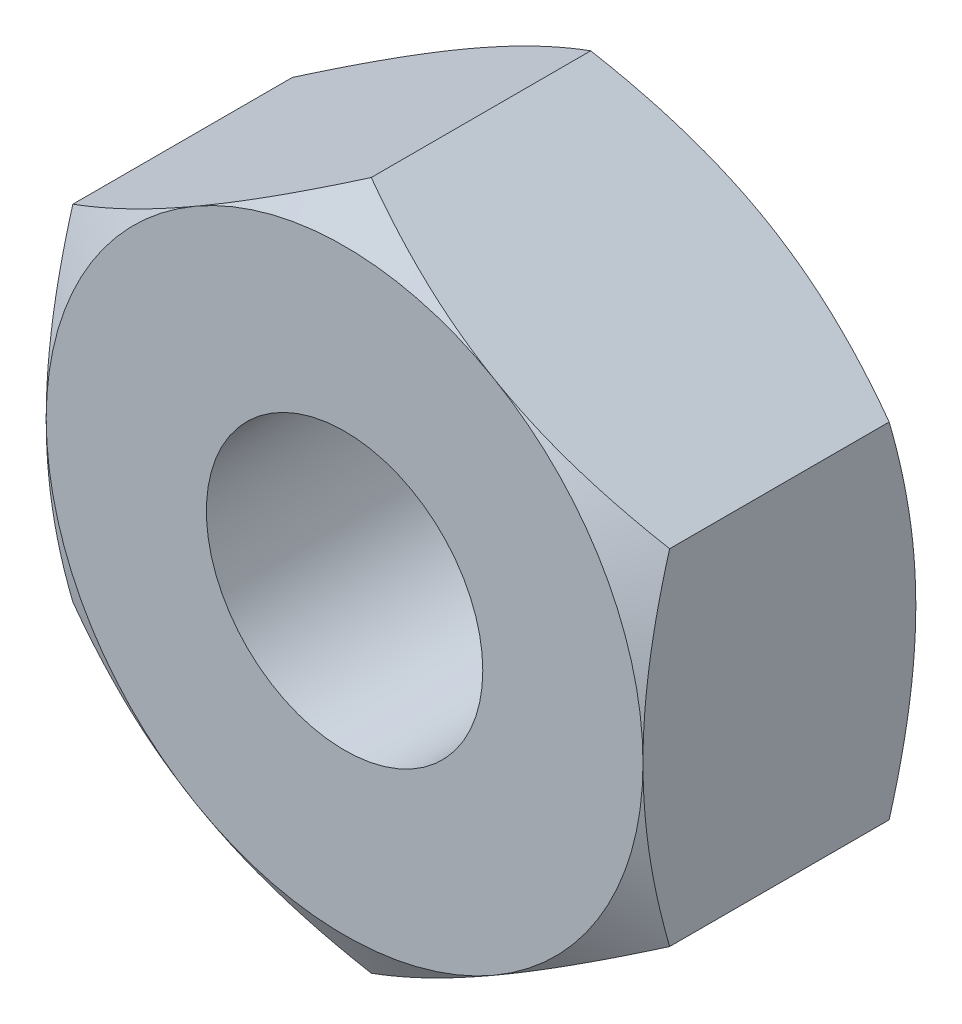
ISO-10303-21;
HEADER;
FILE_DESCRIPTION(('STEP AP214'),'2;1');
FILE_NAME('part.step','',(''),(''),'','','');
FILE_SCHEMA(('AUTOMOTIVE_DESIGN { 1 0 10303 214 1 1 1 1 }'));
ENDSEC;
DATA;
#1=APPLICATION_CONTEXT('core data for automotive mechanical design processes');
#2=APPLICATION_PROTOCOL_DEFINITION('international standard','automotive_design',2000,#1);
#3=PRODUCT_CONTEXT('',#1,'mechanical');
#4=PRODUCT('Part','Part','',(#3));
#5=PRODUCT_RELATED_PRODUCT_CATEGORY('part','',(#4));
#6=PRODUCT_DEFINITION_FORMATION('','',#4);
#7=PRODUCT_DEFINITION_CONTEXT('part definition',#1,'design');
#8=PRODUCT_DEFINITION('design','',#6,#7);
#9=PRODUCT_DEFINITION_SHAPE('','',#8);
#10=(LENGTH_UNIT() NAMED_UNIT(*) SI_UNIT(.MILLI.,.METRE.));
#11=(NAMED_UNIT(*) PLANE_ANGLE_UNIT() SI_UNIT($,.RADIAN.));
#12=(NAMED_UNIT(*) SI_UNIT($,.STERADIAN.) SOLID_ANGLE_UNIT());
#13=UNCERTAINTY_MEASURE_WITH_UNIT(LENGTH_MEASURE(1.E-05),#10,'distance_accuracy_value','');
#14=(GEOMETRIC_REPRESENTATION_CONTEXT(3) GLOBAL_UNCERTAINTY_ASSIGNED_CONTEXT((#13)) GLOBAL_UNIT_ASSIGNED_CONTEXT((#10,
#11,#12)) REPRESENTATION_CONTEXT('',''));
#15=CARTESIAN_POINT('',(0.,0.,0.));
#16=DIRECTION('',(0.,0.,1.));
#17=DIRECTION('',(1.,0.,0.));
#18=AXIS2_PLACEMENT_3D('',#15,#16,#17);
#19=CARTESIAN_POINT('',(3.50000000000002,2.02072594216371,3.2));
#20=DIRECTION('',(-0.499999999999991,-0.866025403784444,0.));
#21=DIRECTION('',(0.866025403784444,-0.499999999999991,0.));
#22=AXIS2_PLACEMENT_3D('',#19,#20,#21);
#23=PLANE('',#22);
#24=CARTESIAN_POINT('',(3.50020000000002,2.02061047210987,2.88732593930662));
#25=CARTESIAN_POINT('',(3.34639282154757,2.10941108799268,2.93861421101));
#26=CARTESIAN_POINT('',(3.1912579891656,2.1989782252291,2.98525904618379));
#27=CARTESIAN_POINT('',(2.87830199342324,2.37966345361546,3.06667812446664));
#28=CARTESIAN_POINT('',(2.72047526921252,2.47078475532383,3.10142356441543));
#29=CARTESIAN_POINT('',(2.40677778961988,2.65189807961074,3.15550997281716));
#30=CARTESIAN_POINT('',(2.25095530083932,2.741862235454,3.17521091373961));
#31=CARTESIAN_POINT('',(1.93857711279463,2.92221386641056,3.19872986726274));
#32=CARTESIAN_POINT('',(1.78202254896577,3.01260068598001,3.20256735545443));
#33=CARTESIAN_POINT('',(1.48949078007901,3.1814939814933,3.19458469812302));
#34=CARTESIAN_POINT('',(1.3534697875421,3.26002573814993,3.1847245659304));
#35=CARTESIAN_POINT('',(1.08231397971101,3.41657761679353,3.1534735331006));
#36=CARTESIAN_POINT('',(0.947180102315319,3.49459719728457,3.13207195671421));
#37=CARTESIAN_POINT('',(0.675465207594818,3.65147186489428,3.07856959211943));
#38=CARTESIAN_POINT('',(0.538918580721666,3.73030709667643,3.04624200555492));
#39=CARTESIAN_POINT('',(0.267861907055499,3.88680174018323,2.97287106619202));
#40=CARTESIAN_POINT('',(0.133348387531464,3.96446315689007,2.93184495343015));
#41=CARTESIAN_POINT('',(-0.0001999999999996,4.0415673543812,2.88732593930664));
#42=B_SPLINE_CURVE_WITH_KNOTS('',3,(#24,#25,#26,#27,#28,#29,#30,#31,#32,#33,#34,#35,#36,#37,#38,
#39,#40,#41),.UNSPECIFIED.,.F.,.F.,(4,2,2,2,2,2,2,2,4),(0.,0.554793832886257,1.11092123814984,
1.6532846708322,2.19498204478404,2.66665130850861,3.13875761298268,3.6213361260051,
4.10296698719187),.UNSPECIFIED.);
#43=CARTESIAN_POINT('',(3.50000000000002,2.02072594216371,2.88739260883034));
#44=VERTEX_POINT('',#43);
#45=CARTESIAN_POINT('',(1.74999999999997,3.03108891324556,3.2));
#46=VERTEX_POINT('',#45);
#47=EDGE_CURVE('E61',#44,#46,#42,.T.);
#48=ORIENTED_EDGE('',*,*,#47,.F.);
#49=DIRECTION('',(0.,0.,-1.));
#50=VECTOR('',#49,1.);
#51=CARTESIAN_POINT('',(3.50000000000002,2.02072594216371,3.2));
#52=LINE('',#51,#50);
#53=CARTESIAN_POINT('',(3.50000000000002,2.02072594216371,0.312607391169656));
#54=VERTEX_POINT('',#53);
#55=EDGE_CURVE('E300',#44,#54,#52,.T.);
#56=ORIENTED_EDGE('',*,*,#55,.T.);
#57=CARTESIAN_POINT('',(-0.000199999999999895,4.0415673543812,0.312674060693357));
#58=CARTESIAN_POINT('',(0.15360717845245,3.95276673849838,0.261385788989971));
#59=CARTESIAN_POINT('',(0.308742010834425,3.86319960126196,0.214740953816186));
#60=CARTESIAN_POINT('',(0.621698006576783,3.68251437287561,0.13332187553334));
#61=CARTESIAN_POINT('',(0.779524730787498,3.59139307116724,0.0985764355845542));
#62=CARTESIAN_POINT('',(1.09322221038013,3.41027974688033,0.0444900271828316));
#63=CARTESIAN_POINT('',(1.24904469916069,3.32031559103708,0.0247890862603784));
#64=CARTESIAN_POINT('',(1.56142288720538,3.13996396008052,0.00127013273725365));
#65=CARTESIAN_POINT('',(1.71797745103423,3.04957714051106,-0.00256735545443443));
#66=CARTESIAN_POINT('',(2.010509219921,2.88068384499778,0.00541530187698012));
#67=CARTESIAN_POINT('',(2.14653021245791,2.80215208834115,0.0152754340696107));
#68=CARTESIAN_POINT('',(2.41768602028901,2.64560020969754,0.0465264668994092));
#69=CARTESIAN_POINT('',(2.5528198976847,2.5675806292065,0.0679280432858048));
#70=CARTESIAN_POINT('',(2.8245347924052,2.41070596159679,0.121430407880586));
#71=CARTESIAN_POINT('',(2.96108141927835,2.33187072981465,0.153757994445096));
#72=CARTESIAN_POINT('',(3.23213809294452,2.17537608630784,0.227128933808006));
#73=CARTESIAN_POINT('',(3.36665161246856,2.097714669601,0.268155046569879));
#74=CARTESIAN_POINT('',(3.50020000000002,2.02061047210987,0.312674060693384));
#75=B_SPLINE_CURVE_WITH_KNOTS('',3,(#57,#58,#59,#60,#61,#62,#63,#64,#65,#66,#67,#68,#69,#70,#71,
#72,#73,#74),.UNSPECIFIED.,.F.,.F.,(4,2,2,2,2,2,2,2,4),(0.,0.554793832886251,1.11092123814983,
1.65328467083218,2.19498204478402,2.66665130850859,3.13875761298267,3.6213361260051,
4.10296698719188),.UNSPECIFIED.);
#76=CARTESIAN_POINT('',(1.74999999999997,3.03108891324556,0.));
#77=VERTEX_POINT('',#76);
#78=EDGE_CURVE('E236',#77,#54,#75,.T.);
#79=ORIENTED_EDGE('',*,*,#78,.F.);
#80=CARTESIAN_POINT('',(0.,4.04145188432736,0.312607391169629));
#81=VERTEX_POINT('',#80);
#82=EDGE_CURVE('E254',#81,#77,#75,.T.);
#83=ORIENTED_EDGE('',*,*,#82,.F.);
#84=DIRECTION('',(0.,0.,-1.));
#85=VECTOR('',#84,1.);
#86=CARTESIAN_POINT('',(0.,4.04145188432736,3.2));
#87=LINE('',#86,#85);
#88=CARTESIAN_POINT('',(0.,4.04145188432736,2.88739260883037));
#89=VERTEX_POINT('',#88);
#90=EDGE_CURVE('E267',#89,#81,#87,.T.);
#91=ORIENTED_EDGE('',*,*,#90,.F.);
#92=EDGE_CURVE('E282',#46,#89,#42,.T.);
#93=ORIENTED_EDGE('',*,*,#92,.F.);
#94=EDGE_LOOP('',(#48,#56,#79,#83,#91,#93));
#95=FACE_BOUND('',#94,.T.);
#96=ADVANCED_FACE('F38',(#95),#23,.F.);
#97=CARTESIAN_POINT('',(0.,4.04145188432736,3.2));
#98=DIRECTION('',(0.499999999999995,-0.866025403784441,0.));
#99=DIRECTION('',(0.866025403784441,0.499999999999996,0.));
#100=AXIS2_PLACEMENT_3D('',#97,#98,#99);
#101=PLANE('',#100);
#102=CARTESIAN_POINT('',(0.000200000000000068,4.0415673543812,2.88732593930664));
#103=CARTESIAN_POINT('',(-0.153607178452449,3.95276673849838,2.93861421101003));
#104=CARTESIAN_POINT('',(-0.308742010834424,3.86319960126196,2.98525904618381));
#105=CARTESIAN_POINT('',(-0.621698006576781,3.68251437287561,3.06667812446666));
#106=CARTESIAN_POINT('',(-0.779524730787495,3.59139307116724,3.10142356441545));
#107=CARTESIAN_POINT('',(-1.09322221038013,3.41027974688033,3.15550997281717));
#108=CARTESIAN_POINT('',(-1.24904469916069,3.32031559103707,3.17521091373963));
#109=CARTESIAN_POINT('',(-1.56142288720537,3.13996396008051,3.19872986726275));
#110=CARTESIAN_POINT('',(-1.71797745103423,3.04957714051106,3.20256735545444));
#111=CARTESIAN_POINT('',(-2.01050921992099,2.88068384499777,3.19458469812303));
#112=CARTESIAN_POINT('',(-2.14653021245791,2.80215208834114,3.1847245659304));
#113=CARTESIAN_POINT('',(-2.41768602028899,2.64560020969753,3.1534735331006));
#114=CARTESIAN_POINT('',(-2.55281989768468,2.5675806292065,3.1320719567142));
#115=CARTESIAN_POINT('',(-2.82453479240518,2.41070596159678,3.07856959211942));
#116=CARTESIAN_POINT('',(-2.96108141927834,2.33187072981464,3.04624200555491));
#117=CARTESIAN_POINT('',(-3.2321380929445,2.17537608630783,2.97287106619201));
#118=CARTESIAN_POINT('',(-3.36665161246854,2.09771466960099,2.93184495343013));
#119=CARTESIAN_POINT('',(-3.5002,2.02061047210986,2.88732593930663));
#120=B_SPLINE_CURVE_WITH_KNOTS('',3,(#102,#103,#104,#105,#106,#107,#108,#109,#110,#111,#112,
#113,#114,#115,#116,#117,#118,#119),.UNSPECIFIED.,.F.,.F.,(4,2,2,2,2,2,2,2,4),(0.,
0.554793832886251,1.11092123814983,1.65328467083218,2.19498204478402,2.66665130850859,
3.13875761298266,3.62133612600509,4.10296698719186),.UNSPECIFIED.);
#121=CARTESIAN_POINT('',(-1.74999999999999,3.03108891324555,3.2));
#122=VERTEX_POINT('',#121);
#123=EDGE_CURVE('E54',#89,#122,#120,.T.);
#124=ORIENTED_EDGE('',*,*,#123,.F.);
#125=ORIENTED_EDGE('',*,*,#90,.T.);
#126=CARTESIAN_POINT('',(-3.5002,2.02061047210986,0.31267406069337));
#127=CARTESIAN_POINT('',(-3.34639282154755,2.10941108799268,0.261385788989983));
#128=CARTESIAN_POINT('',(-3.19125798916558,2.19897822522909,0.214740953816196));
#129=CARTESIAN_POINT('',(-2.87830199342322,2.37966345361545,0.133321875533347));
#130=CARTESIAN_POINT('',(-2.7204752692125,2.47078475532382,0.0985764355845596));
#131=CARTESIAN_POINT('',(-2.40677778961987,2.65189807961073,0.0444900271828333));
#132=CARTESIAN_POINT('',(-2.25095530083931,2.74186223545399,0.0247890862603783));
#133=CARTESIAN_POINT('',(-1.93857711279462,2.92221386641055,0.0012701327372501));
#134=CARTESIAN_POINT('',(-1.78202254896577,3.01260068598001,-0.00256735545443954));
#135=CARTESIAN_POINT('',(-1.48949078007901,3.18149398149329,0.00541530187697198));
#136=CARTESIAN_POINT('',(-1.35346978754209,3.26002573814992,0.0152754340696009));
#137=CARTESIAN_POINT('',(-1.082313979711,3.41657761679353,0.0465264668993961));
#138=CARTESIAN_POINT('',(-0.947180102315315,3.49459719728456,0.06792804328579));
#139=CARTESIAN_POINT('',(-0.675465207594815,3.65147186489428,0.121430407880567));
#140=CARTESIAN_POINT('',(-0.538918580721663,3.73030709667642,0.153757994445076));
#141=CARTESIAN_POINT('',(-0.267861907055498,3.88680174018323,0.227128933807982));
#142=CARTESIAN_POINT('',(-0.133348387531463,3.96446315689007,0.268155046569854));
#143=CARTESIAN_POINT('',(0.000200000000000403,4.0415673543812,0.312674060693358));
#144=B_SPLINE_CURVE_WITH_KNOTS('',3,(#126,#127,#128,#129,#130,#131,#132,#133,#134,#135,#136,
#137,#138,#139,#140,#141,#142,#143),.UNSPECIFIED.,.F.,.F.,(4,2,2,2,2,2,2,2,4),(0.,
0.554793832886254,1.11092123814984,1.65328467083219,2.19498204478403,2.6666513085086,
3.13875761298267,3.62133612600509,4.10296698719186),.UNSPECIFIED.);
#145=CARTESIAN_POINT('',(-1.74999999999998,3.03108891324554,0.));
#146=VERTEX_POINT('',#145);
#147=EDGE_CURVE('E198',#146,#81,#144,.T.);
#148=ORIENTED_EDGE('',*,*,#147,.F.);
#149=CARTESIAN_POINT('',(-3.5,2.02072594216369,0.312607391169643));
#150=VERTEX_POINT('',#149);
#151=EDGE_CURVE('E253',#150,#146,#144,.T.);
#152=ORIENTED_EDGE('',*,*,#151,.F.);
#153=DIRECTION('',(0.,0.,-1.));
#154=VECTOR('',#153,1.);
#155=CARTESIAN_POINT('',(-3.5,2.0207259421637,3.2));
#156=LINE('',#155,#154);
#157=CARTESIAN_POINT('',(-3.5,2.0207259421637,2.88739260883036));
#158=VERTEX_POINT('',#157);
#159=EDGE_CURVE('E291',#158,#150,#156,.T.);
#160=ORIENTED_EDGE('',*,*,#159,.F.);
#161=EDGE_CURVE('E133',#122,#158,#120,.T.);
#162=ORIENTED_EDGE('',*,*,#161,.F.);
#163=EDGE_LOOP('',(#124,#125,#148,#152,#160,#162));
#164=FACE_BOUND('',#163,.T.);
#165=ADVANCED_FACE('F182',(#164),#101,.F.);
#166=CARTESIAN_POINT('',(-3.5,2.0207259421637,3.2));
#167=DIRECTION('',(1.,0.,0.));
#168=DIRECTION('',(0.,1.,0.));
#169=AXIS2_PLACEMENT_3D('',#166,#167,#168);
#170=PLANE('',#169);
#171=CARTESIAN_POINT('',(-3.49999999999998,-5.5274755281958,1.44347007249662));
#172=CARTESIAN_POINT('',(-3.49999999999998,-5.37372622942806,1.51844717307556));
#173=CARTESIAN_POINT('',(-3.49999999999998,-5.2196344657417,1.59273353415013));
#174=CARTESIAN_POINT('',(-3.49999999999998,-4.91058421754996,1.73953812245554));
#175=CARTESIAN_POINT('',(-3.49999999999998,-4.75562560943091,1.81205608917758));
#176=CARTESIAN_POINT('',(-3.49999999999998,-4.44390840933384,1.95528096830741));
#177=CARTESIAN_POINT('',(-3.49999999999998,-4.28714466296956,2.02597669970993));
#178=CARTESIAN_POINT('',(-3.49999999999998,-3.97240446581533,2.16460453031009));
#179=CARTESIAN_POINT('',(-3.49999999999998,-3.81442806995853,2.23253675382692));
#180=CARTESIAN_POINT('',(-3.49999999999998,-3.49158188309475,2.36717547077697));
#181=CARTESIAN_POINT('',(-3.49999999999998,-3.32666117073996,2.43376050209091));
#182=CARTESIAN_POINT('',(-3.49999999999999,-2.99492744280665,2.5621279710108));
#183=CARTESIAN_POINT('',(-3.49999999999999,-2.82811422277033,2.6239098839377));
#184=CARTESIAN_POINT('',(-3.49999999999999,-2.49261126726259,2.74112201247845));
#185=CARTESIAN_POINT('',(-3.49999999999999,-2.32392577723557,2.79656426257449));
#186=CARTESIAN_POINT('',(-3.49999999999999,-1.98413704064268,2.89938430337881));
#187=CARTESIAN_POINT('',(-3.49999999999999,-1.81303454151602,2.94676453052719));
#188=CARTESIAN_POINT('',(-3.49999999999999,-1.46926530405379,3.03100086845278));
#189=CARTESIAN_POINT('',(-3.49999999999999,-1.296613407194,3.06791646176417));
#190=CARTESIAN_POINT('',(-3.49999999999999,-0.949062219267497,3.12920355544621));
#191=CARTESIAN_POINT('',(-3.49999999999999,-0.774163178767844,3.1535764421568));
#192=CARTESIAN_POINT('',(-3.49999999999999,-0.425315012837556,3.18752012223861));
#193=CARTESIAN_POINT('',(-3.49999999999999,-0.251385641598625,3.19728891338473));
#194=CARTESIAN_POINT('',(-3.5,0.0966848827766961,3.20172425462782));
#195=CARTESIAN_POINT('',(-3.5,0.270826038538338,3.19639061557001));
#196=CARTESIAN_POINT('',(-3.5,0.563556219191337,3.17511676381855));
#197=CARTESIAN_POINT('',(-3.5,0.682444447104659,3.1630262795363));
#198=CARTESIAN_POINT('',(-3.5,0.919409772611291,3.13250644883794));
#199=CARTESIAN_POINT('',(-3.5,1.03748676882481,3.11407632434138));
#200=CARTESIAN_POINT('',(-3.5,1.39030731524239,3.05023917047794));
#201=CARTESIAN_POINT('',(-3.5,1.62352663458402,2.99629478055012));
#202=CARTESIAN_POINT('',(-3.5,1.97246374212529,2.90198374629423));
#203=CARTESIAN_POINT('',(-3.5,2.08996778731763,2.86784291317552));
#204=CARTESIAN_POINT('',(-3.5,2.3238363192327,2.79582473258671));
#205=CARTESIAN_POINT('',(-3.5,2.44020079699526,2.75794735576287));
#206=CARTESIAN_POINT('',(-3.50000000000001,2.67182485902198,2.67907960956254));
#207=CARTESIAN_POINT('',(-3.50000000000001,2.78708473483684,2.63809008860559));
#208=CARTESIAN_POINT('',(-3.50000000000001,3.01663563833894,2.55349925249792));
#209=CARTESIAN_POINT('',(-3.50000000000001,3.13092668947534,2.50989800076802));
#210=CARTESIAN_POINT('',(-3.50000000000001,3.4424238711739,2.38763495015914));
#211=CARTESIAN_POINT('',(-3.50000000000001,3.63876810673243,2.3067791538002));
#212=CARTESIAN_POINT('',(-3.50000000000001,4.02939361773507,2.14021128017685));
#213=CARTESIAN_POINT('',(-3.50000000000001,4.2236746469157,2.05449863076716));
#214=CARTESIAN_POINT('',(-3.50000000000001,4.61064862479033,1.87938669166087));
#215=CARTESIAN_POINT('',(-3.50000000000001,4.80334096212261,1.78998605555322));
#216=CARTESIAN_POINT('',(-3.50000000000001,5.18740432133651,1.60838432232883));
#217=CARTESIAN_POINT('',(-3.50000000000001,5.37877530077497,1.51618313576483));
#218=CARTESIAN_POINT('',(-3.50000000000002,5.76076297601776,1.32945163217988));
#219=CARTESIAN_POINT('',(-3.50000000000002,5.95137792730074,1.23491775396072));
#220=CARTESIAN_POINT('',(-3.50000000000002,6.33174098662072,1.04412006233259));
#221=CARTESIAN_POINT('',(-3.50000000000002,6.52148908521012,0.947856230125409));
#222=CARTESIAN_POINT('',(-3.50000000000002,7.08958847589595,0.657050938640543));
#223=CARTESIAN_POINT('',(-3.50000000000002,7.46688549599338,0.460450936602844));
#224=CARTESIAN_POINT('',(-3.50000000000002,8.17883115472204,0.0850737052660838));
#225=CARTESIAN_POINT('',(-3.50000000000003,8.5136774682376,-0.093330448390855));
#226=CARTESIAN_POINT('',(-3.50000000000003,9.18225339251813,-0.452270184164183));
#227=CARTESIAN_POINT('',(-3.50000000000003,9.5159829287799,-0.63280590498313));
#228=CARTESIAN_POINT('',(-3.50000000000003,10.1814287091803,-0.994821508577032));
#229=CARTESIAN_POINT('',(-3.50000000000003,10.5131479214205,-1.17629594407262));
#230=CARTESIAN_POINT('',(-3.50000000000003,11.1758898576765,-1.54044809319759));
#231=CARTESIAN_POINT('',(-3.50000000000004,11.5069126369099,-1.7231257062923));
#232=CARTESIAN_POINT('',(-3.50000000000004,11.8376919189626,-1.90624045241287));
#233=B_SPLINE_CURVE_WITH_KNOTS('',3,(#171,#172,#173,#174,#175,#176,#177,#178,#179,#180,#181,
#182,#183,#184,#185,#186,#187,#188,#189,#190,#191,#192,#193,#194,#195,#196,#197,#198,#199,#200,
#201,#202,#203,#204,#205,#206,#207,#208,#209,#210,#211,#212,#213,#214,#215,#216,#217,#218,#219,
#220,#221,#222,#223,#224,#225,#226,#227,#228,#229,#230,#231,#232),.UNSPECIFIED.,.F.,.F.,(4,2,2,
2,2,2,2,2,2,2,2,2,2,2,2,2,2,2,2,2,2,2,2,2,2,2,2,2,2,2,4),(0.,0.513176065968777,1.02642727863608,
1.54230782313467,2.0581651345032,2.59167231100649,3.12523768467524,3.65777276764035,
4.1901466251637,4.71943076454303,5.24865638980308,5.77063972476674,6.29262959749126,
6.65096196839927,7.00933833406707,7.72643202890318,8.09348824670022,8.4605473482654,
8.82750674056805,9.19445722558126,9.83138168024823,10.4683813222797,11.1056156148603,
11.7428702816196,12.3811667165831,13.0194700916665,14.2957736419783,15.4339885701988,
16.5722779755783,17.7066189546709,18.8408663239038),.UNSPECIFIED.);
#234=CARTESIAN_POINT('',(-3.5,0.,3.2));
#235=VERTEX_POINT('',#234);
#236=EDGE_CURVE('E127',#158,#235,#233,.F.);
#237=ORIENTED_EDGE('',*,*,#236,.F.);
#238=ORIENTED_EDGE('',*,*,#159,.T.);
#239=CARTESIAN_POINT('',(-3.49999999999998,-5.5274755281958,1.75652992750338));
#240=CARTESIAN_POINT('',(-3.49999999999998,-5.37372622942806,1.68155282692444));
#241=CARTESIAN_POINT('',(-3.49999999999998,-5.2196344657417,1.60726646584987));
#242=CARTESIAN_POINT('',(-3.49999999999998,-4.91058421754996,1.46046187754447));
#243=CARTESIAN_POINT('',(-3.49999999999998,-4.75562560943091,1.38794391082242));
#244=CARTESIAN_POINT('',(-3.49999999999998,-4.44390840933384,1.24471903169259));
#245=CARTESIAN_POINT('',(-3.49999999999998,-4.28714466296956,1.17402330029007));
#246=CARTESIAN_POINT('',(-3.49999999999998,-3.97240446581533,1.03539546968991));
#247=CARTESIAN_POINT('',(-3.49999999999998,-3.81442806995853,0.967463246173076));
#248=CARTESIAN_POINT('',(-3.49999999999998,-3.49158188309474,0.832824529223031));
#249=CARTESIAN_POINT('',(-3.49999999999998,-3.32666117073995,0.766239497909093));
#250=CARTESIAN_POINT('',(-3.49999999999999,-2.99492744280664,0.637872028989194));
#251=CARTESIAN_POINT('',(-3.49999999999999,-2.82811422277033,0.576090116062302));
#252=CARTESIAN_POINT('',(-3.49999999999999,-2.49261126726259,0.45887798752155));
#253=CARTESIAN_POINT('',(-3.49999999999999,-2.32392577723557,0.403435737425511));
#254=CARTESIAN_POINT('',(-3.49999999999999,-1.98413704064268,0.300615696621188));
#255=CARTESIAN_POINT('',(-3.49999999999999,-1.81303454151602,0.253235469472808));
#256=CARTESIAN_POINT('',(-3.49999999999999,-1.46926530405379,0.16899913154722));
#257=CARTESIAN_POINT('',(-3.49999999999999,-1.29661340719399,0.132083538235825));
#258=CARTESIAN_POINT('',(-3.49999999999999,-0.949062219267496,0.0707964445537896));
#259=CARTESIAN_POINT('',(-3.49999999999999,-0.774163178767844,0.0464235578432014));
#260=CARTESIAN_POINT('',(-3.49999999999999,-0.425315012837556,0.012479877761386));
#261=CARTESIAN_POINT('',(-3.49999999999999,-0.251385641598625,0.00271108661527034));
#262=CARTESIAN_POINT('',(-3.5,0.0966848827766967,-0.00172425462781566));
#263=CARTESIAN_POINT('',(-3.5,0.270826038538338,0.00360938442998938));
#264=CARTESIAN_POINT('',(-3.5,0.563556219191337,0.0248832361814537));
#265=CARTESIAN_POINT('',(-3.5,0.68244444710466,0.0369737204636969));
#266=CARTESIAN_POINT('',(-3.5,0.919409772611292,0.0674935511620587));
#267=CARTESIAN_POINT('',(-3.5,1.03748676882481,0.0859236756586205));
#268=CARTESIAN_POINT('',(-3.5,1.39030731524239,0.149760829522062));
#269=CARTESIAN_POINT('',(-3.5,1.62352663458402,0.203705219449886));
#270=CARTESIAN_POINT('',(-3.5,1.97246374212529,0.29801625370577));
#271=CARTESIAN_POINT('',(-3.5,2.08996778731763,0.332157086824476));
#272=CARTESIAN_POINT('',(-3.5,2.3238363192327,0.404175267413294));
#273=CARTESIAN_POINT('',(-3.5,2.44020079699526,0.442052644237132));
#274=CARTESIAN_POINT('',(-3.50000000000001,2.67182485902198,0.52092039043746));
#275=CARTESIAN_POINT('',(-3.50000000000001,2.78708473483684,0.561909911394407));
#276=CARTESIAN_POINT('',(-3.50000000000001,3.01663563833894,0.64650074750208));
#277=CARTESIAN_POINT('',(-3.50000000000001,3.13092668947534,0.690101999231977));
#278=CARTESIAN_POINT('',(-3.50000000000001,3.4424238711739,0.81236504984086));
#279=CARTESIAN_POINT('',(-3.50000000000001,3.63876810673244,0.893220846199796));
#280=CARTESIAN_POINT('',(-3.50000000000001,4.02939361773507,1.05978871982315));
#281=CARTESIAN_POINT('',(-3.50000000000001,4.2236746469157,1.14550136923284));
#282=CARTESIAN_POINT('',(-3.50000000000001,4.61064862479032,1.32061330833913));
#283=CARTESIAN_POINT('',(-3.50000000000001,4.80334096212261,1.41001394444678));
#284=CARTESIAN_POINT('',(-3.50000000000001,5.18740432133651,1.59161567767117));
#285=CARTESIAN_POINT('',(-3.50000000000001,5.37877530077496,1.68381686423517));
#286=CARTESIAN_POINT('',(-3.50000000000002,5.76076297601776,1.87054836782012));
#287=CARTESIAN_POINT('',(-3.50000000000002,5.95137792730074,1.96508224603928));
#288=CARTESIAN_POINT('',(-3.50000000000002,6.33174098662072,2.15587993766741));
#289=CARTESIAN_POINT('',(-3.50000000000002,6.52148908521011,2.25214376987459));
#290=CARTESIAN_POINT('',(-3.50000000000002,7.08958847589594,2.54294906135945));
#291=CARTESIAN_POINT('',(-3.50000000000002,7.46688549599337,2.73954906339715));
#292=CARTESIAN_POINT('',(-3.50000000000002,8.17883115472203,3.11492629473391));
#293=CARTESIAN_POINT('',(-3.50000000000003,8.51367746823759,3.29333044839085));
#294=CARTESIAN_POINT('',(-3.50000000000003,9.18225339251812,3.65227018416418));
#295=CARTESIAN_POINT('',(-3.50000000000003,9.5159829287799,3.83280590498313));
#296=CARTESIAN_POINT('',(-3.50000000000003,10.1814287091803,4.19482150857703));
#297=CARTESIAN_POINT('',(-3.50000000000003,10.5131479214205,4.37629594407262));
#298=CARTESIAN_POINT('',(-3.50000000000003,11.1758898576765,4.74044809319759));
#299=CARTESIAN_POINT('',(-3.50000000000004,11.5069126369099,4.9231257062923));
#300=CARTESIAN_POINT('',(-3.50000000000004,11.8376919189626,5.10624045241287));
#301=B_SPLINE_CURVE_WITH_KNOTS('',3,(#239,#240,#241,#242,#243,#244,#245,#246,#247,#248,#249,
#250,#251,#252,#253,#254,#255,#256,#257,#258,#259,#260,#261,#262,#263,#264,#265,#266,#267,#268,
#269,#270,#271,#272,#273,#274,#275,#276,#277,#278,#279,#280,#281,#282,#283,#284,#285,#286,#287,
#288,#289,#290,#291,#292,#293,#294,#295,#296,#297,#298,#299,#300),.UNSPECIFIED.,.F.,.F.,(4,2,2,
2,2,2,2,2,2,2,2,2,2,2,2,2,2,2,2,2,2,2,2,2,2,2,2,2,2,2,4),(0.,0.513176065968776,1.02642727863608,
1.54230782313467,2.0581651345032,2.59167231100649,3.12523768467525,3.65777276764036,
4.1901466251637,4.71943076454303,5.24865638980308,5.77063972476674,6.29262959749127,
6.65096196839927,7.00933833406707,7.72643202890318,8.09348824670022,8.4605473482654,
8.82750674056805,9.19445722558126,9.83138168024824,10.4683813222797,11.1056156148603,
11.7428702816196,12.3811667165831,13.0194700916665,14.2957736419783,15.4339885701988,
16.5722779755783,17.7066189546709,18.8408663239038),.UNSPECIFIED.);
#302=CARTESIAN_POINT('',(-3.5,0.,0.));
#303=VERTEX_POINT('',#302);
#304=EDGE_CURVE('E188',#303,#150,#301,.T.);
#305=ORIENTED_EDGE('',*,*,#304,.F.);
#306=CARTESIAN_POINT('',(-3.49999999999999,-2.02072594216372,0.312607391169643));
#307=VERTEX_POINT('',#306);
#308=EDGE_CURVE('E196',#307,#303,#301,.T.);
#309=ORIENTED_EDGE('',*,*,#308,.F.);
#310=DIRECTION('',(0.,0.,-1.));
#311=VECTOR('',#310,1.);
#312=CARTESIAN_POINT('',(-3.49999999999999,-2.02072594216372,3.2));
#313=LINE('',#312,#311);
#314=CARTESIAN_POINT('',(-3.49999999999999,-2.02072594216372,2.88739260883036));
#315=VERTEX_POINT('',#314);
#316=EDGE_CURVE('E155',#315,#307,#313,.T.);
#317=ORIENTED_EDGE('',*,*,#316,.F.);
#318=EDGE_CURVE('E137',#235,#315,#233,.F.);
#319=ORIENTED_EDGE('',*,*,#318,.F.);
#320=EDGE_LOOP('',(#237,#238,#305,#309,#317,#319));
#321=FACE_BOUND('',#320,.T.);
#322=ADVANCED_FACE('F153',(#321),#170,.F.);
#323=CARTESIAN_POINT('',(-3.49999999999999,-2.02072594216372,3.2));
#324=DIRECTION('',(0.499999999999997,0.866025403784441,0.));
#325=DIRECTION('',(-0.866025403784441,0.499999999999997,0.));
#326=AXIS2_PLACEMENT_3D('',#323,#324,#325);
#327=PLANE('',#326);
#328=CARTESIAN_POINT('',(-3.50019999999999,-2.02061047210988,2.88732593930663));
#329=CARTESIAN_POINT('',(-3.34639282154754,-2.1094110879927,2.93861421101002));
#330=CARTESIAN_POINT('',(-3.19125798916556,-2.19897822522912,2.9852590461838));
#331=CARTESIAN_POINT('',(-2.87830199342321,-2.37966345361548,3.06667812446665));
#332=CARTESIAN_POINT('',(-2.72047526921249,-2.47078475532385,3.10142356441544));
#333=CARTESIAN_POINT('',(-2.40677778961986,-2.65189807961076,3.15550997281716));
#334=CARTESIAN_POINT('',(-2.25095530083929,-2.74186223545402,3.17521091373961));
#335=CARTESIAN_POINT('',(-1.93857711279461,-2.92221386641058,3.19872986726274));
#336=CARTESIAN_POINT('',(-1.78202254896575,-3.01260068598003,3.20256735545443));
#337=CARTESIAN_POINT('',(-1.48949078007899,-3.18149398149332,3.19458469812302));
#338=CARTESIAN_POINT('',(-1.35346978754208,-3.26002573814995,3.18472456593039));
#339=CARTESIAN_POINT('',(-1.08231397971099,-3.41657761679356,3.15347353310059));
#340=CARTESIAN_POINT('',(-0.947180102315303,-3.49459719728459,3.1320719567142));
#341=CARTESIAN_POINT('',(-0.675465207594803,-3.6514718648943,3.07856959211942));
#342=CARTESIAN_POINT('',(-0.538918580721652,-3.73030709667645,3.04624200555491));
#343=CARTESIAN_POINT('',(-0.267861907055487,-3.88680174018325,2.972871066192));
#344=CARTESIAN_POINT('',(-0.133348387531453,-3.9644631568901,2.93184495343013));
#345=CARTESIAN_POINT('',(0.000200000000010199,-4.04156735438123,2.88732593930663));
#346=B_SPLINE_CURVE_WITH_KNOTS('',3,(#328,#329,#330,#331,#332,#333,#334,#335,#336,#337,#338,
#339,#340,#341,#342,#343,#344,#345),.UNSPECIFIED.,.F.,.F.,(4,2,2,2,2,2,2,2,4),(0.,
0.554793832886254,1.11092123814984,1.65328467083219,2.19498204478403,2.6666513085086,
3.13875761298267,3.62133612600509,4.10296698719186),.UNSPECIFIED.);
#347=CARTESIAN_POINT('',(-1.74999999999999,-3.03108891324554,3.2));
#348=VERTEX_POINT('',#347);
#349=EDGE_CURVE('E144',#315,#348,#346,.T.);
#350=ORIENTED_EDGE('',*,*,#349,.F.);
#351=ORIENTED_EDGE('',*,*,#316,.T.);
#352=CARTESIAN_POINT('',(0.000200000000010408,-4.04156735438123,0.312674060693374));
#353=CARTESIAN_POINT('',(-0.15360717845244,-3.95276673849841,0.261385788989986));
#354=CARTESIAN_POINT('',(-0.308742010834415,-3.86319960126199,0.2147409538162));
#355=CARTESIAN_POINT('',(-0.621698006576774,-3.68251437287563,0.133321875533352));
#356=CARTESIAN_POINT('',(-0.77952473078749,-3.59139307116726,0.098576435584565));
#357=CARTESIAN_POINT('',(-1.09322221038012,-3.41027974688035,0.0444900271828401));
#358=CARTESIAN_POINT('',(-1.24904469916069,-3.32031559103709,0.0247890862603856));
#359=CARTESIAN_POINT('',(-1.56142288720537,-3.13996396008053,0.00127013273725878));
#360=CARTESIAN_POINT('',(-1.71797745103423,-3.04957714051107,-0.00256735545443004));
#361=CARTESIAN_POINT('',(-2.01050921992099,-2.88068384499779,0.00541530187698266));
#362=CARTESIAN_POINT('',(-2.1465302124579,-2.80215208834116,0.0152754340696119));
#363=CARTESIAN_POINT('',(-2.41768602028899,-2.64560020969755,0.0465264668994081));
#364=CARTESIAN_POINT('',(-2.55281989768468,-2.56758062920652,0.0679280432858025));
#365=CARTESIAN_POINT('',(-2.82453479240518,-2.41070596159681,0.121430407880581));
#366=CARTESIAN_POINT('',(-2.96108141927833,-2.33187072981466,0.15375799444509));
#367=CARTESIAN_POINT('',(-3.23213809294449,-2.17537608630786,0.227128933807995));
#368=CARTESIAN_POINT('',(-3.36665161246853,-2.09771466960101,0.268155046569867));
#369=CARTESIAN_POINT('',(-3.50019999999999,-2.02061047210988,0.31267406069337));
#370=B_SPLINE_CURVE_WITH_KNOTS('',3,(#352,#353,#354,#355,#356,#357,#358,#359,#360,#361,#362,
#363,#364,#365,#366,#367,#368,#369),.UNSPECIFIED.,.F.,.F.,(4,2,2,2,2,2,2,2,4),(0.,
0.554793832886255,1.11092123814984,1.65328467083219,2.19498204478404,2.6666513085086,
3.13875761298267,3.62133612600509,4.10296698719186),.UNSPECIFIED.);
#371=CARTESIAN_POINT('',(-1.74999999999999,-3.03108891324555,0.));
#372=VERTEX_POINT('',#371);
#373=EDGE_CURVE('E197',#372,#307,#370,.T.);
#374=ORIENTED_EDGE('',*,*,#373,.F.);
#375=CARTESIAN_POINT('',(0.,-4.04145188432739,0.312607391169646));
#376=VERTEX_POINT('',#375);
#377=EDGE_CURVE('E241',#376,#372,#370,.T.);
#378=ORIENTED_EDGE('',*,*,#377,.F.);
#379=DIRECTION('',(0.,0.,-1.));
#380=VECTOR('',#379,1.);
#381=CARTESIAN_POINT('',(0.,-4.04145188432739,3.2));
#382=LINE('',#381,#380);
#383=CARTESIAN_POINT('',(0.,-4.04145188432739,2.88739260883035));
#384=VERTEX_POINT('',#383);
#385=EDGE_CURVE('E296',#384,#376,#382,.T.);
#386=ORIENTED_EDGE('',*,*,#385,.F.);
#387=EDGE_CURVE('E156',#348,#384,#346,.T.);
#388=ORIENTED_EDGE('',*,*,#387,.F.);
#389=EDGE_LOOP('',(#350,#351,#374,#378,#386,#388));
#390=FACE_BOUND('',#389,.T.);
#391=ADVANCED_FACE('F181',(#390),#327,.F.);
#392=CARTESIAN_POINT('',(0.,-4.04145188432739,3.2));
#393=DIRECTION('',(-0.500000000000001,0.866025403784438,0.));
#394=DIRECTION('',(-0.866025403784438,-0.500000000000001,0.));
#395=AXIS2_PLACEMENT_3D('',#392,#393,#394);
#396=PLANE('',#395);
#397=CARTESIAN_POINT('',(-0.000199999999989673,-4.04156735438123,2.88732593930663));
#398=CARTESIAN_POINT('',(0.15360717845246,-3.95276673849841,2.93861421101001));
#399=CARTESIAN_POINT('',(0.308742010834435,-3.86319960126199,2.9852590461838));
#400=CARTESIAN_POINT('',(0.621698006576793,-3.68251437287563,3.06667812446665));
#401=CARTESIAN_POINT('',(0.779524730787508,-3.59139307116726,3.10142356441544));
#402=CARTESIAN_POINT('',(1.09322221038014,-3.41027974688034,3.15550997281716));
#403=CARTESIAN_POINT('',(1.2490446991607,-3.32031559103709,3.17521091373961));
#404=CARTESIAN_POINT('',(1.56142288720539,-3.13996396008052,3.19872986726274));
#405=CARTESIAN_POINT('',(1.71797745103424,-3.04957714051107,3.20256735545443));
#406=CARTESIAN_POINT('',(2.010509219921,-2.88068384499778,3.19458469812302));
#407=CARTESIAN_POINT('',(2.14653021245792,-2.80215208834115,3.18472456593039));
#408=CARTESIAN_POINT('',(2.41768602028901,-2.64560020969754,3.15347353310059));
#409=CARTESIAN_POINT('',(2.5528198976847,-2.5675806292065,3.1320719567142));
#410=CARTESIAN_POINT('',(2.8245347924052,-2.41070596159679,3.07856959211942));
#411=CARTESIAN_POINT('',(2.96108141927835,-2.33187072981464,3.04624200555491));
#412=CARTESIAN_POINT('',(3.23213809294452,-2.17537608630783,2.972871066192));
#413=CARTESIAN_POINT('',(3.36665161246855,-2.09771466960099,2.93184495343013));
#414=CARTESIAN_POINT('',(3.50020000000002,-2.02061047210985,2.88732593930662));
#415=B_SPLINE_CURVE_WITH_KNOTS('',3,(#397,#398,#399,#400,#401,#402,#403,#404,#405,#406,#407,
#408,#409,#410,#411,#412,#413,#414),.UNSPECIFIED.,.F.,.F.,(4,2,2,2,2,2,2,2,4),(0.,
0.554793832886255,1.11092123814984,1.65328467083219,2.19498204478403,2.66665130850861,
3.13875761298268,3.6213361260051,4.10296698719188),.UNSPECIFIED.);
#416=CARTESIAN_POINT('',(1.75,-3.03108891324554,3.2));
#417=VERTEX_POINT('',#416);
#418=EDGE_CURVE('E416',#384,#417,#415,.T.);
#419=ORIENTED_EDGE('',*,*,#418,.F.);
#420=ORIENTED_EDGE('',*,*,#385,.T.);
#421=CARTESIAN_POINT('',(3.50020000000002,-2.02061047210985,0.312674060693377));
#422=CARTESIAN_POINT('',(3.34639282154757,-2.10941108799267,0.261385788989989));
#423=CARTESIAN_POINT('',(3.19125798916559,-2.19897822522909,0.214740953816203));
#424=CARTESIAN_POINT('',(2.87830199342323,-2.37966345361545,0.133321875533354));
#425=CARTESIAN_POINT('',(2.72047526921252,-2.47078475532383,0.0985764355845666));
#426=CARTESIAN_POINT('',(2.40677778961989,-2.65189807961074,0.0444900271828412));
#427=CARTESIAN_POINT('',(2.25095530083932,-2.741862235454,0.0247890862603868));
#428=CARTESIAN_POINT('',(1.93857711279464,-2.92221386641056,0.00127013273725938));
#429=CARTESIAN_POINT('',(1.78202254896578,-3.01260068598002,-0.00256735545443007));
#430=CARTESIAN_POINT('',(1.48949078007902,-3.18149398149331,0.00541530187698224));
#431=CARTESIAN_POINT('',(1.3534697875421,-3.26002573814994,0.0152754340696118));
#432=CARTESIAN_POINT('',(1.08231397971102,-3.41657761679354,0.046526466899408));
#433=CARTESIAN_POINT('',(0.947180102315328,-3.49459719728458,0.0679280432858024));
#434=CARTESIAN_POINT('',(0.675465207594827,-3.6514718648943,0.121430407880581));
#435=CARTESIAN_POINT('',(0.538918580721675,-3.73030709667645,0.15375799444509));
#436=CARTESIAN_POINT('',(0.267861907055509,-3.88680174018325,0.227128933807997));
#437=CARTESIAN_POINT('',(0.133348387531474,-3.9644631568901,0.26815504656987));
#438=CARTESIAN_POINT('',(-0.000199999999989686,-4.04156735438123,0.312674060693373));
#439=B_SPLINE_CURVE_WITH_KNOTS('',3,(#421,#422,#423,#424,#425,#426,#427,#428,#429,#430,#431,
#432,#433,#434,#435,#436,#437,#438),.UNSPECIFIED.,.F.,.F.,(4,2,2,2,2,2,2,2,4),(0.,
0.554793832886256,1.11092123814984,1.65328467083219,2.19498204478404,2.66665130850861,
3.13875761298268,3.6213361260051,4.10296698719188),.UNSPECIFIED.);
#440=CARTESIAN_POINT('',(1.75000000000001,-3.03108891324554,0.));
#441=VERTEX_POINT('',#440);
#442=EDGE_CURVE('E247',#441,#376,#439,.T.);
#443=ORIENTED_EDGE('',*,*,#442,.F.);
#444=CARTESIAN_POINT('',(3.50000000000002,-2.02072594216382,0.312607391169566));
#445=VERTEX_POINT('',#444);
#446=EDGE_CURVE('E229',#445,#441,#439,.T.);
#447=ORIENTED_EDGE('',*,*,#446,.F.);
#448=DIRECTION('',(0.,0.,-1.));
#449=VECTOR('',#448,1.);
#450=CARTESIAN_POINT('',(3.50000000000002,-2.02072594216369,3.2));
#451=LINE('',#450,#449);
#452=CARTESIAN_POINT('',(3.50000000000002,-2.02072594216382,2.88739260883043));
#453=VERTEX_POINT('',#452);
#454=EDGE_CURVE('E298',#453,#445,#451,.T.);
#455=ORIENTED_EDGE('',*,*,#454,.F.);
#456=EDGE_CURVE('E409',#417,#453,#415,.T.);
#457=ORIENTED_EDGE('',*,*,#456,.F.);
#458=EDGE_LOOP('',(#419,#420,#443,#447,#455,#457));
#459=FACE_BOUND('',#458,.T.);
#460=ADVANCED_FACE('F317',(#459),#396,.F.);
#461=CARTESIAN_POINT('',(3.50000000000002,-2.02072594216369,3.2));
#462=DIRECTION('',(-1.,0.,0.));
#463=DIRECTION('',(0.,-1.,0.));
#464=AXIS2_PLACEMENT_3D('',#461,#462,#463);
#465=PLANE('',#464);
#466=CARTESIAN_POINT('',(3.50000000000001,-5.52747553339011,1.4434700699629));
#467=CARTESIAN_POINT('',(3.50000000000001,-5.37372623444741,1.51844717064731));
#468=CARTESIAN_POINT('',(3.50000000000001,-5.21963447058598,1.5927335318273));
#469=CARTESIAN_POINT('',(3.50000000000001,-4.91058422204355,1.73953812034302));
#470=CARTESIAN_POINT('',(3.50000000000001,-4.7556256137489,1.81205608716997));
#471=CARTESIAN_POINT('',(3.50000000000001,-4.44390841329801,1.95528096650965));
#472=CARTESIAN_POINT('',(3.50000000000001,-4.2871446667555,2.0259766980171));
#473=CARTESIAN_POINT('',(3.50000000000001,-3.97240446924363,2.16460452882539));
#474=CARTESIAN_POINT('',(3.50000000000001,-3.81442807320742,2.23253675244544));
#475=CARTESIAN_POINT('',(3.50000000000001,-3.49158188597035,2.36717546960521));
#476=CARTESIAN_POINT('',(3.50000000000001,-3.32666117342157,2.43376050102542));
#477=CARTESIAN_POINT('',(3.50000000000001,-2.99492744509719,2.56212797015226));
#478=CARTESIAN_POINT('',(3.50000000000002,-2.8281142248638,2.62390988317983));
#479=CARTESIAN_POINT('',(3.50000000000002,-2.49261126895828,2.74112201191245));
#480=CARTESIAN_POINT('',(3.50000000000002,-2.32392577873057,2.79656426209972));
#481=CARTESIAN_POINT('',(3.50000000000002,-1.98413704173088,2.89938430307186));
#482=CARTESIAN_POINT('',(3.50000000000002,-1.81303454239811,2.94676453029683));
#483=CARTESIAN_POINT('',(3.50000000000002,-1.4692653044195,3.03100086837725));
#484=CARTESIAN_POINT('',(3.50000000000002,-1.29661340724801,3.06791646176115));
#485=CARTESIAN_POINT('',(3.50000000000002,-0.949062218690424,3.12920355554145));
#486=CARTESIAN_POINT('',(3.50000000000002,-0.774163177871384,3.15357644227783));
#487=CARTESIAN_POINT('',(3.50000000000002,-0.425315011307502,3.18752012235417));
#488=CARTESIAN_POINT('',(3.50000000000002,-0.251385639754435,3.19728891347009));
#489=CARTESIAN_POINT('',(3.50000000000002,0.0966848852445841,3.20172425459744));
#490=CARTESIAN_POINT('',(3.50000000000002,0.270826041315786,3.19639061545408));
#491=CARTESIAN_POINT('',(3.50000000000002,0.563556222354853,3.17511676352938));
#492=CARTESIAN_POINT('',(3.50000000000002,0.682444450348204,3.16302627917871));
#493=CARTESIAN_POINT('',(3.50000000000002,0.919409776011234,3.1325064483399));
#494=CARTESIAN_POINT('',(3.50000000000002,1.03748677230112,3.11407632377131));
#495=CARTESIAN_POINT('',(3.50000000000002,1.39030731894352,3.05023916969034));
#496=CARTESIAN_POINT('',(3.50000000000002,1.62352663842894,2.99629477961564));
#497=CARTESIAN_POINT('',(3.50000000000002,1.97246374618526,2.9019837451432));
#498=CARTESIAN_POINT('',(3.50000000000002,2.08996779145087,2.86784291195182));
#499=CARTESIAN_POINT('',(3.50000000000002,2.32383632351163,2.79582473121995));
#500=CARTESIAN_POINT('',(3.50000000000002,2.4402008013466,2.75794735432574));
#501=CARTESIAN_POINT('',(3.50000000000002,2.67182486351757,2.67907960798727));
#502=CARTESIAN_POINT('',(3.50000000000002,2.78708473940427,2.63809008696256));
#503=CARTESIAN_POINT('',(3.50000000000003,3.01663564305007,2.55349925072179));
#504=CARTESIAN_POINT('',(3.50000000000003,3.13092669425832,2.50989799892657));
#505=CARTESIAN_POINT('',(3.50000000000003,3.44242387599614,2.38763494820387));
#506=CARTESIAN_POINT('',(3.50000000000003,3.63876811152434,2.30677915180395));
#507=CARTESIAN_POINT('',(3.50000000000003,4.02939362247025,2.14021127811072));
#508=CARTESIAN_POINT('',(3.50000000000003,4.2236746516245,2.05449862867216));
#509=CARTESIAN_POINT('',(3.50000000000003,4.61064862944922,1.87938668951683));
#510=CARTESIAN_POINT('',(3.50000000000003,4.80334096675799,1.78998605338904));
#511=CARTESIAN_POINT('',(3.50000000000003,5.18740432592734,1.60838432013049));
#512=CARTESIAN_POINT('',(3.50000000000003,5.37877530534476,1.51618313355249));
#513=CARTESIAN_POINT('',(3.50000000000003,5.7607629805461,1.32945162994463));
#514=CARTESIAN_POINT('',(3.50000000000003,5.95137793180866,1.23491775171658));
#515=CARTESIAN_POINT('',(3.50000000000003,6.33174099108931,1.04412006007399));
#516=CARTESIAN_POINT('',(3.50000000000003,6.5214890896598,0.947856227861261));
#517=CARTESIAN_POINT('',(3.50000000000003,7.08958848029112,0.657050936363207));
#518=CARTESIAN_POINT('',(3.50000000000003,7.46688550035469,0.460450934321567));
#519=CARTESIAN_POINT('',(3.50000000000003,8.17883115905002,0.0850737029680137));
#520=CARTESIAN_POINT('',(3.50000000000004,8.51367747256569,-0.0933304507026071));
#521=CARTESIAN_POINT('',(3.50000000000004,9.18225339684773,-0.452270186500508));
#522=CARTESIAN_POINT('',(3.50000000000004,9.5159829331109,-0.632805907330344));
#523=CARTESIAN_POINT('',(3.50000000000004,10.1814287135198,-0.994821510946777));
#524=CARTESIAN_POINT('',(3.50000000000004,10.5131479257673,-1.17629594645404));
#525=CARTESIAN_POINT('',(3.50000000000004,11.1758898620384,-1.54044809560111));
#526=CARTESIAN_POINT('',(3.50000000000004,11.5069126412798,-1.72312570870627));
#527=CARTESIAN_POINT('',(3.50000000000004,11.8376919233407,-1.90624045483687));
#528=B_SPLINE_CURVE_WITH_KNOTS('',3,(#466,#467,#468,#469,#470,#471,#472,#473,#474,#475,#476,
#477,#478,#479,#480,#481,#482,#483,#484,#485,#486,#487,#488,#489,#490,#491,#492,#493,#494,#495,
#496,#497,#498,#499,#500,#501,#502,#503,#504,#505,#506,#507,#508,#509,#510,#511,#512,#513,#514,
#515,#516,#517,#518,#519,#520,#521,#522,#523,#524,#525,#526,#527),.UNSPECIFIED.,.F.,.F.,(4,2,2,
2,2,2,2,2,2,2,2,2,2,2,2,2,2,2,2,2,2,2,2,2,2,2,2,2,2,2,4),(0.,0.513176066579237,1.02642727985709,
1.5423078249725,2.0581651369578,2.59167231412004,3.12523768844798,3.65777277207018,
4.19014663025011,4.71943077058733,5.24865639680387,5.77063973269973,6.29262960635686,
6.65096197752444,7.00933834345185,7.72643203880833,8.0934882568774,8.46054735871459,
8.82750675128852,9.19445723657305,9.83138169120318,10.4683813331974,11.1056156257396,
11.7428702924604,12.3811667273808,13.0194701024212,14.2957736526485,15.4339885808886,
16.5722779862874,17.7066189654157,18.8408663346847),.UNSPECIFIED.);
#529=CARTESIAN_POINT('',(3.50000000000002,0.,3.2));
#530=VERTEX_POINT('',#529);
#531=EDGE_CURVE('E411',#453,#530,#528,.T.);
#532=ORIENTED_EDGE('',*,*,#531,.F.);
#533=ORIENTED_EDGE('',*,*,#454,.T.);
#534=CARTESIAN_POINT('',(3.50000000000001,-5.52747553339011,1.7565299300371));
#535=CARTESIAN_POINT('',(3.50000000000001,-5.37372623444741,1.68155282935269));
#536=CARTESIAN_POINT('',(3.50000000000001,-5.21963447058598,1.6072664681727));
#537=CARTESIAN_POINT('',(3.50000000000001,-4.91058422204355,1.46046187965698));
#538=CARTESIAN_POINT('',(3.50000000000001,-4.7556256137489,1.38794391283003));
#539=CARTESIAN_POINT('',(3.50000000000001,-4.44390841329801,1.24471903349035));
#540=CARTESIAN_POINT('',(3.50000000000001,-4.28714466675551,1.1740233019829));
#541=CARTESIAN_POINT('',(3.50000000000001,-3.97240446924363,1.03539547117461));
#542=CARTESIAN_POINT('',(3.50000000000001,-3.81442807320742,0.967463247554558));
#543=CARTESIAN_POINT('',(3.50000000000001,-3.49158188597035,0.832824530394788));
#544=CARTESIAN_POINT('',(3.50000000000001,-3.32666117342157,0.766239498974583));
#545=CARTESIAN_POINT('',(3.50000000000001,-2.99492744509719,0.63787202984774));
#546=CARTESIAN_POINT('',(3.50000000000002,-2.8281142248638,0.576090116820174));
#547=CARTESIAN_POINT('',(3.50000000000002,-2.49261126895828,0.458877988087546));
#548=CARTESIAN_POINT('',(3.50000000000002,-2.32392577873057,0.40343573790028));
#549=CARTESIAN_POINT('',(3.50000000000002,-1.98413704173088,0.300615696928142));
#550=CARTESIAN_POINT('',(3.50000000000002,-1.81303454239811,0.253235469703166));
#551=CARTESIAN_POINT('',(3.50000000000002,-1.4692653044195,0.168999131622748));
#552=CARTESIAN_POINT('',(3.50000000000002,-1.29661340724801,0.132083538238845));
#553=CARTESIAN_POINT('',(3.50000000000002,-0.949062218690423,0.0707964444585483));
#554=CARTESIAN_POINT('',(3.50000000000002,-0.774163177871384,0.04642355772217));
#555=CARTESIAN_POINT('',(3.50000000000002,-0.425315011307502,0.0124798776458346));
#556=CARTESIAN_POINT('',(3.50000000000002,-0.251385639754434,0.00271108652991365));
#557=CARTESIAN_POINT('',(3.50000000000002,0.0966848852445847,-0.00172425459743683));
#558=CARTESIAN_POINT('',(3.50000000000002,0.270826041315786,0.00360938454592128));
#559=CARTESIAN_POINT('',(3.50000000000002,0.563556222354853,0.024883236470617));
#560=CARTESIAN_POINT('',(3.50000000000002,0.682444450348204,0.0369737208212891));
#561=CARTESIAN_POINT('',(3.50000000000002,0.919409776011233,0.0674935516601046));
#562=CARTESIAN_POINT('',(3.50000000000002,1.03748677230112,0.0859236762286916));
#563=CARTESIAN_POINT('',(3.50000000000002,1.39030731894352,0.149760830309664));
#564=CARTESIAN_POINT('',(3.50000000000002,1.62352663842894,0.20370522038436));
#565=CARTESIAN_POINT('',(3.50000000000002,1.97246374618525,0.298016254856797));
#566=CARTESIAN_POINT('',(3.50000000000002,2.08996779145087,0.332157088048178));
#567=CARTESIAN_POINT('',(3.50000000000002,2.32383632351162,0.404175268780046));
#568=CARTESIAN_POINT('',(3.50000000000002,2.44020080134659,0.442052645674259));
#569=CARTESIAN_POINT('',(3.50000000000002,2.67182486351757,0.520920392012731));
#570=CARTESIAN_POINT('',(3.50000000000002,2.78708473940427,0.561909913037443));
#571=CARTESIAN_POINT('',(3.50000000000003,3.01663564305007,0.646500749278208));
#572=CARTESIAN_POINT('',(3.50000000000003,3.13092669425832,0.690102001073433));
#573=CARTESIAN_POINT('',(3.50000000000003,3.44242387599614,0.812365051796127));
#574=CARTESIAN_POINT('',(3.50000000000003,3.63876811152434,0.893220848196055));
#575=CARTESIAN_POINT('',(3.50000000000003,4.02939362247025,1.05978872188928));
#576=CARTESIAN_POINT('',(3.50000000000003,4.2236746516245,1.14550137132785));
#577=CARTESIAN_POINT('',(3.50000000000003,4.61064862944922,1.32061331048317));
#578=CARTESIAN_POINT('',(3.50000000000003,4.80334096675799,1.41001394661097));
#579=CARTESIAN_POINT('',(3.50000000000003,5.18740432592734,1.59161567986951));
#580=CARTESIAN_POINT('',(3.50000000000003,5.37877530534476,1.68381686644751));
#581=CARTESIAN_POINT('',(3.50000000000003,5.7607629805461,1.87054837005537));
#582=CARTESIAN_POINT('',(3.50000000000003,5.95137793180866,1.96508224828342));
#583=CARTESIAN_POINT('',(3.50000000000003,6.33174099108932,2.15587993992601));
#584=CARTESIAN_POINT('',(3.50000000000003,6.5214890896598,2.25214377213874));
#585=CARTESIAN_POINT('',(3.50000000000003,7.08958848029112,2.54294906363679));
#586=CARTESIAN_POINT('',(3.50000000000003,7.46688550035469,2.73954906567843));
#587=CARTESIAN_POINT('',(3.50000000000003,8.17883115905002,3.11492629703199));
#588=CARTESIAN_POINT('',(3.50000000000004,8.51367747256569,3.29333045070261));
#589=CARTESIAN_POINT('',(3.50000000000004,9.18225339684773,3.65227018650051));
#590=CARTESIAN_POINT('',(3.50000000000004,9.5159829331109,3.83280590733035));
#591=CARTESIAN_POINT('',(3.50000000000004,10.1814287135198,4.19482151094678));
#592=CARTESIAN_POINT('',(3.50000000000004,10.5131479257673,4.37629594645404));
#593=CARTESIAN_POINT('',(3.50000000000004,11.1758898620384,4.74044809560112));
#594=CARTESIAN_POINT('',(3.50000000000004,11.5069126412798,4.92312570870627));
#595=CARTESIAN_POINT('',(3.50000000000004,11.8376919233407,5.10624045483687));
#596=B_SPLINE_CURVE_WITH_KNOTS('',3,(#534,#535,#536,#537,#538,#539,#540,#541,#542,#543,#544,
#545,#546,#547,#548,#549,#550,#551,#552,#553,#554,#555,#556,#557,#558,#559,#560,#561,#562,#563,
#564,#565,#566,#567,#568,#569,#570,#571,#572,#573,#574,#575,#576,#577,#578,#579,#580,#581,#582,
#583,#584,#585,#586,#587,#588,#589,#590,#591,#592,#593,#594,#595),.UNSPECIFIED.,.F.,.F.,(4,2,2,
2,2,2,2,2,2,2,2,2,2,2,2,2,2,2,2,2,2,2,2,2,2,2,2,2,2,2,4),(0.,0.513176066579237,1.02642727985709,
1.54230782497249,2.05816513695779,2.59167231412004,3.12523768844798,3.65777277207018,
4.19014663025011,4.71943077058733,5.24865639680387,5.77063973269973,6.29262960635686,
6.65096197752444,7.00933834345185,7.72643203880833,8.0934882568774,8.46054735871459,
8.82750675128852,9.19445723657305,9.83138169120318,10.4683813331974,11.1056156257396,
11.7428702924604,12.3811667273808,13.0194701024212,14.2957736526485,15.4339885808886,
16.5722779862874,17.7066189654157,18.8408663346847),.UNSPECIFIED.);
#597=CARTESIAN_POINT('',(3.50000000000002,0.,0.));
#598=VERTEX_POINT('',#597);
#599=EDGE_CURVE('E220',#598,#445,#596,.F.);
#600=ORIENTED_EDGE('',*,*,#599,.F.);
#601=EDGE_CURVE('E149',#54,#598,#596,.F.);
#602=ORIENTED_EDGE('',*,*,#601,.F.);
#603=ORIENTED_EDGE('',*,*,#55,.F.);
#604=EDGE_CURVE('E419',#530,#44,#528,.T.);
#605=ORIENTED_EDGE('',*,*,#604,.F.);
#606=EDGE_LOOP('',(#532,#533,#600,#602,#603,#605));
#607=FACE_BOUND('',#606,.T.);
#608=ADVANCED_FACE('F311',(#607),#465,.F.);
#609=CARTESIAN_POINT('',(3.50000000000002,2.02072594216371,3.2));
#610=DIRECTION('',(0.,0.,-1.));
#611=DIRECTION('',(-1.,0.,0.));
#612=AXIS2_PLACEMENT_3D('',#609,#610,#611);
#613=PLANE('',#612);
#614=CARTESIAN_POINT('',(0.,0.,3.2));
#615=DIRECTION('',(0.,0.,1.));
#616=DIRECTION('',(1.,0.,0.));
#617=AXIS2_PLACEMENT_3D('',#614,#615,#616);
#618=CIRCLE('',#617,1.621125);
#619=CARTESIAN_POINT('',(1.621125,0.,3.2));
#620=VERTEX_POINT('',#619);
#621=EDGE_CURVE('E204',#620,#620,#618,.T.);
#622=ORIENTED_EDGE('',*,*,#621,.F.);
#623=EDGE_LOOP('',(#622));
#624=FACE_BOUND('',#623,.T.);
#625=CARTESIAN_POINT('',(0.,0.,3.2));
#626=DIRECTION('',(0.,0.,-1.));
#627=DIRECTION('',(-1.,0.,0.));
#628=AXIS2_PLACEMENT_3D('',#625,#626,#627);
#629=CIRCLE('',#628,3.5);
#630=EDGE_CURVE('E12',#235,#122,#629,.T.);
#631=ORIENTED_EDGE('',*,*,#630,.F.);
#632=EDGE_CURVE('E42',#348,#235,#629,.T.);
#633=ORIENTED_EDGE('',*,*,#632,.F.);
#634=EDGE_CURVE('E148',#417,#348,#629,.T.);
#635=ORIENTED_EDGE('',*,*,#634,.F.);
#636=EDGE_CURVE('E413',#530,#417,#629,.T.);
#637=ORIENTED_EDGE('',*,*,#636,.F.);
#638=CARTESIAN_POINT('',(0.,0.,3.2));
#639=DIRECTION('',(0.,0.,1.));
#640=DIRECTION('',(1.,0.,0.));
#641=AXIS2_PLACEMENT_3D('',#638,#639,#640);
#642=CIRCLE('',#641,3.5);
#643=EDGE_CURVE('E512',#530,#46,#642,.T.);
#644=ORIENTED_EDGE('',*,*,#643,.T.);
#645=EDGE_CURVE('E47',#122,#46,#629,.T.);
#646=ORIENTED_EDGE('',*,*,#645,.F.);
#647=EDGE_LOOP('',(#631,#633,#635,#637,#644,#646));
#648=FACE_BOUND('',#647,.T.);
#649=ADVANCED_FACE('F150',(#624,#648),#613,.F.);
#650=CARTESIAN_POINT('',(3.50000000000002,2.02072594216371,0.));
#651=DIRECTION('',(0.,0.,-1.));
#652=DIRECTION('',(-1.,0.,0.));
#653=AXIS2_PLACEMENT_3D('',#650,#651,#652);
#654=PLANE('',#653);
#655=CARTESIAN_POINT('',(0.,0.,0.));
#656=DIRECTION('',(0.,0.,1.));
#657=DIRECTION('',(1.,0.,0.));
#658=AXIS2_PLACEMENT_3D('',#655,#656,#657);
#659=CIRCLE('',#658,1.621125);
#660=CARTESIAN_POINT('',(1.621125,0.,0.));
#661=VERTEX_POINT('',#660);
#662=EDGE_CURVE('E301',#661,#661,#659,.T.);
#663=ORIENTED_EDGE('',*,*,#662,.T.);
#664=EDGE_LOOP('',(#663));
#665=FACE_BOUND('',#664,.T.);
#666=CARTESIAN_POINT('',(0.,0.,0.));
#667=DIRECTION('',(0.,0.,-1.));
#668=DIRECTION('',(-1.,0.,0.));
#669=AXIS2_PLACEMENT_3D('',#666,#667,#668);
#670=CIRCLE('',#669,3.5);
#671=EDGE_CURVE('E277',#372,#303,#670,.T.);
#672=ORIENTED_EDGE('',*,*,#671,.T.);
#673=EDGE_CURVE('E263',#303,#146,#670,.T.);
#674=ORIENTED_EDGE('',*,*,#673,.T.);
#675=EDGE_CURVE('E275',#146,#77,#670,.T.);
#676=ORIENTED_EDGE('',*,*,#675,.T.);
#677=EDGE_CURVE('E279',#77,#598,#670,.T.);
#678=ORIENTED_EDGE('',*,*,#677,.T.);
#679=EDGE_CURVE('E281',#598,#441,#670,.T.);
#680=ORIENTED_EDGE('',*,*,#679,.T.);
#681=EDGE_CURVE('E280',#441,#372,#670,.T.);
#682=ORIENTED_EDGE('',*,*,#681,.T.);
#683=EDGE_LOOP('',(#672,#674,#676,#678,#680,#682));
#684=FACE_BOUND('',#683,.T.);
#685=ADVANCED_FACE('F273',(#665,#684),#654,.T.);
#686=CARTESIAN_POINT('',(0.,0.,3.2));
#687=DIRECTION('',(0.,0.,-1.));
#688=DIRECTION('',(-1.,0.,0.));
#689=AXIS2_PLACEMENT_3D('',#686,#687,#688);
#690=CYLINDRICAL_SURFACE('',#689,1.621125);
#691=ORIENTED_EDGE('',*,*,#621,.T.);
#692=EDGE_LOOP('',(#691));
#693=FACE_BOUND('',#692,.T.);
#694=ORIENTED_EDGE('',*,*,#662,.F.);
#695=EDGE_LOOP('',(#694));
#696=FACE_BOUND('',#695,.T.);
#697=ADVANCED_FACE('F214',(#693,#696),#690,.F.);
#698=CARTESIAN_POINT('',(0.,0.,0.));
#699=DIRECTION('',(0.,0.,1.));
#700=DIRECTION('',(-1.,0.,0.));
#701=AXIS2_PLACEMENT_3D('',#698,#699,#700);
#702=CONICAL_SURFACE('',#701,3.5,1.0471975511966);
#703=ORIENTED_EDGE('',*,*,#446,.T.);
#704=ORIENTED_EDGE('',*,*,#679,.F.);
#705=ORIENTED_EDGE('',*,*,#599,.T.);
#706=EDGE_LOOP('',(#703,#704,#705));
#707=FACE_BOUND('',#706,.T.);
#708=ADVANCED_FACE('F213',(#707),#702,.T.);
#709=ORIENTED_EDGE('',*,*,#78,.T.);
#710=ORIENTED_EDGE('',*,*,#601,.T.);
#711=ORIENTED_EDGE('',*,*,#677,.F.);
#712=EDGE_LOOP('',(#709,#710,#711));
#713=FACE_BOUND('',#712,.T.);
#714=ADVANCED_FACE('F429',(#713),#702,.T.);
#715=ORIENTED_EDGE('',*,*,#377,.T.);
#716=ORIENTED_EDGE('',*,*,#681,.F.);
#717=ORIENTED_EDGE('',*,*,#442,.T.);
#718=EDGE_LOOP('',(#715,#716,#717));
#719=FACE_BOUND('',#718,.T.);
#720=ADVANCED_FACE('F211',(#719),#702,.T.);
#721=ORIENTED_EDGE('',*,*,#308,.T.);
#722=ORIENTED_EDGE('',*,*,#671,.F.);
#723=ORIENTED_EDGE('',*,*,#373,.T.);
#724=EDGE_LOOP('',(#721,#722,#723));
#725=FACE_BOUND('',#724,.T.);
#726=ADVANCED_FACE('F206',(#725),#702,.T.);
#727=ORIENTED_EDGE('',*,*,#304,.T.);
#728=ORIENTED_EDGE('',*,*,#151,.T.);
#729=ORIENTED_EDGE('',*,*,#673,.F.);
#730=EDGE_LOOP('',(#727,#728,#729));
#731=FACE_BOUND('',#730,.T.);
#732=ADVANCED_FACE('F210',(#731),#702,.T.);
#733=ORIENTED_EDGE('',*,*,#147,.T.);
#734=ORIENTED_EDGE('',*,*,#82,.T.);
#735=ORIENTED_EDGE('',*,*,#675,.F.);
#736=EDGE_LOOP('',(#733,#734,#735));
#737=FACE_BOUND('',#736,.T.);
#738=ADVANCED_FACE('F363',(#737),#702,.T.);
#739=CARTESIAN_POINT('',(0.,0.,3.2));
#740=DIRECTION('',(0.,0.,-1.));
#741=DIRECTION('',(1.,0.,0.));
#742=AXIS2_PLACEMENT_3D('',#739,#740,#741);
#743=CONICAL_SURFACE('',#742,3.5,1.0471975511966);
#744=ORIENTED_EDGE('',*,*,#318,.T.);
#745=ORIENTED_EDGE('',*,*,#349,.T.);
#746=ORIENTED_EDGE('',*,*,#632,.T.);
#747=EDGE_LOOP('',(#744,#745,#746));
#748=FACE_BOUND('',#747,.T.);
#749=ADVANCED_FACE('F142',(#748),#743,.T.);
#750=ORIENTED_EDGE('',*,*,#387,.T.);
#751=ORIENTED_EDGE('',*,*,#418,.T.);
#752=ORIENTED_EDGE('',*,*,#634,.T.);
#753=EDGE_LOOP('',(#750,#751,#752));
#754=FACE_BOUND('',#753,.T.);
#755=ADVANCED_FACE('F362',(#754),#743,.T.);
#756=ORIENTED_EDGE('',*,*,#456,.T.);
#757=ORIENTED_EDGE('',*,*,#531,.T.);
#758=ORIENTED_EDGE('',*,*,#636,.T.);
#759=EDGE_LOOP('',(#756,#757,#758));
#760=FACE_BOUND('',#759,.T.);
#761=ADVANCED_FACE('F373',(#760),#743,.T.);
#762=ORIENTED_EDGE('',*,*,#47,.T.);
#763=ORIENTED_EDGE('',*,*,#643,.F.);
#764=ORIENTED_EDGE('',*,*,#604,.T.);
#765=EDGE_LOOP('',(#762,#763,#764));
#766=FACE_BOUND('',#765,.T.);
#767=ADVANCED_FACE('F176',(#766),#743,.T.);
#768=ORIENTED_EDGE('',*,*,#92,.T.);
#769=ORIENTED_EDGE('',*,*,#123,.T.);
#770=ORIENTED_EDGE('',*,*,#645,.T.);
#771=EDGE_LOOP('',(#768,#769,#770));
#772=FACE_BOUND('',#771,.T.);
#773=ADVANCED_FACE('F288',(#772),#743,.T.);
#774=ORIENTED_EDGE('',*,*,#161,.T.);
#775=ORIENTED_EDGE('',*,*,#236,.T.);
#776=ORIENTED_EDGE('',*,*,#630,.T.);
#777=EDGE_LOOP('',(#774,#775,#776));
#778=FACE_BOUND('',#777,.T.);
#779=ADVANCED_FACE('F129',(#778),#743,.T.);
#780=CLOSED_SHELL('',(#96,#165,#322,#391,#460,#608,#649,#685,#697,#708,#714,#720,#726,#732,#738,
#749,#755,#761,#767,#773,#779));
#781=MANIFOLD_SOLID_BREP('B2',#780);
#782=ADVANCED_BREP_SHAPE_REPRESENTATION('',(#18,#781),#14);
#783=SHAPE_DEFINITION_REPRESENTATION(#9,#782);
ENDSEC;
END-ISO-10303-21;
